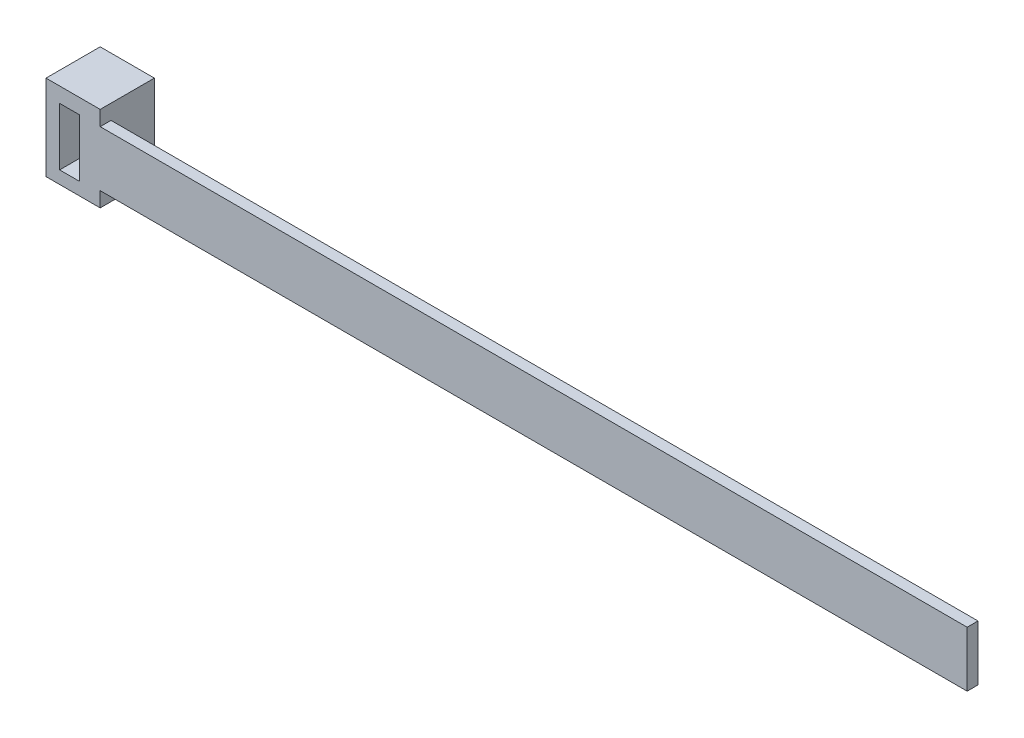
ISO-10303-21;
HEADER;
FILE_DESCRIPTION(('STEP AP214'),'2;1');
FILE_NAME('part.step','',(''),(''),'','','');
FILE_SCHEMA(('AUTOMOTIVE_DESIGN { 1 0 10303 214 1 1 1 1 }'));
ENDSEC;
DATA;
#1=APPLICATION_CONTEXT('core data for automotive mechanical design processes');
#2=APPLICATION_PROTOCOL_DEFINITION('international standard','automotive_design',2000,#1);
#3=PRODUCT_CONTEXT('',#1,'mechanical');
#4=PRODUCT('Part','Part','',(#3));
#5=PRODUCT_RELATED_PRODUCT_CATEGORY('part','',(#4));
#6=PRODUCT_DEFINITION_FORMATION('','',#4);
#7=PRODUCT_DEFINITION_CONTEXT('part definition',#1,'design');
#8=PRODUCT_DEFINITION('design','',#6,#7);
#9=PRODUCT_DEFINITION_SHAPE('','',#8);
#10=(LENGTH_UNIT() NAMED_UNIT(*) SI_UNIT(.MILLI.,.METRE.));
#11=(NAMED_UNIT(*) PLANE_ANGLE_UNIT() SI_UNIT($,.RADIAN.));
#12=(NAMED_UNIT(*) SI_UNIT($,.STERADIAN.) SOLID_ANGLE_UNIT());
#13=UNCERTAINTY_MEASURE_WITH_UNIT(LENGTH_MEASURE(1.E-05),#10,'distance_accuracy_value','');
#14=(GEOMETRIC_REPRESENTATION_CONTEXT(3) GLOBAL_UNCERTAINTY_ASSIGNED_CONTEXT((#13)) GLOBAL_UNIT_ASSIGNED_CONTEXT((#10,
#11,#12)) REPRESENTATION_CONTEXT('',''));
#15=CARTESIAN_POINT('',(0.,0.,0.));
#16=DIRECTION('',(0.,0.,1.));
#17=DIRECTION('',(1.,0.,0.));
#18=AXIS2_PLACEMENT_3D('',#15,#16,#17);
#19=CARTESIAN_POINT('',(-73.0239217256212,5.,-9.38083837570739));
#20=DIRECTION('',(1.,0.,0.));
#21=DIRECTION('',(0.,0.,-1.));
#22=AXIS2_PLACEMENT_3D('',#19,#20,#21);
#23=PLANE('',#22);
#24=DIRECTION('',(0.,0.,1.));
#25=VECTOR('',#24,1.);
#26=CARTESIAN_POINT('',(-73.0239217256212,-5.,-9.38083837570739));
#27=LINE('',#26,#25);
#28=CARTESIAN_POINT('',(-73.0239217256212,-5.,-9.38083837570739));
#29=VERTEX_POINT('',#28);
#30=CARTESIAN_POINT('',(-73.0239217256212,-5.,-3.03083837570739));
#31=VERTEX_POINT('',#30);
#32=EDGE_CURVE('E206',#29,#31,#27,.T.);
#33=ORIENTED_EDGE('',*,*,#32,.T.);
#34=DIRECTION('',(0.,-1.,0.));
#35=VECTOR('',#34,1.);
#36=CARTESIAN_POINT('',(-73.0239217256212,5.,-3.03083837570739));
#37=LINE('',#36,#35);
#38=CARTESIAN_POINT('',(-73.0239217256212,5.,-3.03083837570739));
#39=VERTEX_POINT('',#38);
#40=EDGE_CURVE('E11',#39,#31,#37,.T.);
#41=ORIENTED_EDGE('',*,*,#40,.F.);
#42=DIRECTION('',(0.,0.,1.));
#43=VECTOR('',#42,1.);
#44=CARTESIAN_POINT('',(-73.0239217256212,5.,-9.38083837570739));
#45=LINE('',#44,#43);
#46=CARTESIAN_POINT('',(-73.0239217256212,5.,-9.38083837570739));
#47=VERTEX_POINT('',#46);
#48=EDGE_CURVE('E207',#47,#39,#45,.T.);
#49=ORIENTED_EDGE('',*,*,#48,.F.);
#50=DIRECTION('',(0.,-1.,0.));
#51=VECTOR('',#50,1.);
#52=CARTESIAN_POINT('',(-73.0239217256212,5.,-9.38083837570739));
#53=LINE('',#52,#51);
#54=EDGE_CURVE('E149',#47,#29,#53,.T.);
#55=ORIENTED_EDGE('',*,*,#54,.T.);
#56=EDGE_LOOP('',(#33,#41,#49,#55));
#57=FACE_BOUND('',#56,.T.);
#58=ADVANCED_FACE('F33',(#57),#23,.F.);
#59=CARTESIAN_POINT('',(-66.6739217256212,5.,-3.03083837570739));
#60=DIRECTION('',(0.,0.,-1.));
#61=DIRECTION('',(-1.,0.,0.));
#62=AXIS2_PLACEMENT_3D('',#59,#60,#61);
#63=PLANE('',#62);
#64=DIRECTION('',(1.,0.,0.));
#65=VECTOR('',#64,1.);
#66=CARTESIAN_POINT('',(-71.4239447150806,-3.51553287453044,-3.03083837570739));
#67=LINE('',#66,#65);
#68=CARTESIAN_POINT('',(-71.4239447150806,-3.51553287453044,-3.03083837570739));
#69=VERTEX_POINT('',#68);
#70=CARTESIAN_POINT('',(-69.1172689263801,-3.51553287453044,-3.03083837570739));
#71=VERTEX_POINT('',#70);
#72=EDGE_CURVE('E177',#69,#71,#67,.T.);
#73=ORIENTED_EDGE('',*,*,#72,.F.);
#74=DIRECTION('',(0.,-1.,0.));
#75=VECTOR('',#74,1.);
#76=CARTESIAN_POINT('',(-71.4239447150806,3.2345140651131,-3.03083837570739));
#77=LINE('',#76,#75);
#78=CARTESIAN_POINT('',(-71.4239447150806,3.2345140651131,-3.03083837570739));
#79=VERTEX_POINT('',#78);
#80=EDGE_CURVE('E180',#79,#69,#77,.T.);
#81=ORIENTED_EDGE('',*,*,#80,.F.);
#82=DIRECTION('',(-1.,0.,0.));
#83=VECTOR('',#82,1.);
#84=CARTESIAN_POINT('',(-71.4239447150806,3.2345140651131,-3.03083837570739));
#85=LINE('',#84,#83);
#86=CARTESIAN_POINT('',(-69.1172689263801,3.2345140651131,-3.03083837570739));
#87=VERTEX_POINT('',#86);
#88=EDGE_CURVE('E197',#87,#79,#85,.T.);
#89=ORIENTED_EDGE('',*,*,#88,.F.);
#90=DIRECTION('',(0.,1.,0.));
#91=VECTOR('',#90,1.);
#92=CARTESIAN_POINT('',(-69.1172689263801,3.2345140651131,-3.03083837570739));
#93=LINE('',#92,#91);
#94=EDGE_CURVE('E55',#71,#87,#93,.T.);
#95=ORIENTED_EDGE('',*,*,#94,.F.);
#96=EDGE_LOOP('',(#73,#81,#89,#95));
#97=FACE_BOUND('',#96,.T.);
#98=DIRECTION('',(0.,-1.,0.));
#99=VECTOR('',#98,1.);
#100=CARTESIAN_POINT('',(-66.6739217256212,-5.,-3.03083837570739));
#101=LINE('',#100,#99);
#102=CARTESIAN_POINT('',(-66.6739217256212,-3.24674392594689,-3.03083837570739));
#103=VERTEX_POINT('',#102);
#104=CARTESIAN_POINT('',(-66.6739217256212,-5.,-3.03083837570739));
#105=VERTEX_POINT('',#104);
#106=EDGE_CURVE('E164',#103,#105,#101,.T.);
#107=ORIENTED_EDGE('',*,*,#106,.F.);
#108=DIRECTION('',(-1.,0.,0.));
#109=VECTOR('',#108,1.);
#110=CARTESIAN_POINT('',(34.9260782743788,-3.24674392594689,-3.03083837570739));
#111=LINE('',#110,#109);
#112=CARTESIAN_POINT('',(34.9260782743788,-3.24674392594689,-3.03083837570739));
#113=VERTEX_POINT('',#112);
#114=EDGE_CURVE('E126',#113,#103,#111,.T.);
#115=ORIENTED_EDGE('',*,*,#114,.F.);
#116=DIRECTION('',(0.,-1.,0.));
#117=VECTOR('',#116,1.);
#118=CARTESIAN_POINT('',(34.9260782743788,5.,-3.03083837570739));
#119=LINE('',#118,#117);
#120=CARTESIAN_POINT('',(34.9260782743788,3.24674392594687,-3.03083837570739));
#121=VERTEX_POINT('',#120);
#122=EDGE_CURVE('E40',#121,#113,#119,.T.);
#123=ORIENTED_EDGE('',*,*,#122,.F.);
#124=DIRECTION('',(1.,0.,0.));
#125=VECTOR('',#124,1.);
#126=CARTESIAN_POINT('',(-66.6739217256212,3.24674392594689,-3.03083837570739));
#127=LINE('',#126,#125);
#128=CARTESIAN_POINT('',(-66.6739217256212,3.24674392594689,-3.03083837570739));
#129=VERTEX_POINT('',#128);
#130=EDGE_CURVE('E162',#129,#121,#127,.T.);
#131=ORIENTED_EDGE('',*,*,#130,.F.);
#132=DIRECTION('',(0.,-1.,0.));
#133=VECTOR('',#132,1.);
#134=CARTESIAN_POINT('',(-66.6739217256212,5.,-3.03083837570739));
#135=LINE('',#134,#133);
#136=CARTESIAN_POINT('',(-66.6739217256212,5.,-3.03083837570739));
#137=VERTEX_POINT('',#136);
#138=EDGE_CURVE('E170',#137,#129,#135,.T.);
#139=ORIENTED_EDGE('',*,*,#138,.F.);
#140=DIRECTION('',(1.,0.,0.));
#141=VECTOR('',#140,1.);
#142=CARTESIAN_POINT('',(-73.0239217256212,5.,-3.03083837570739));
#143=LINE('',#142,#141);
#144=EDGE_CURVE('E210',#39,#137,#143,.T.);
#145=ORIENTED_EDGE('',*,*,#144,.F.);
#146=ORIENTED_EDGE('',*,*,#40,.T.);
#147=DIRECTION('',(1.,0.,0.));
#148=VECTOR('',#147,1.);
#149=CARTESIAN_POINT('',(-66.6739217256212,-5.,-3.03083837570739));
#150=LINE('',#149,#148);
#151=EDGE_CURVE('E220',#31,#105,#150,.T.);
#152=ORIENTED_EDGE('',*,*,#151,.T.);
#153=EDGE_LOOP('',(#107,#115,#123,#131,#139,#145,#146,#152));
#154=FACE_BOUND('',#153,.T.);
#155=ADVANCED_FACE('F160',(#97,#154),#63,.F.);
#156=CARTESIAN_POINT('',(34.9260782743788,5.,-3.03083837570739));
#157=DIRECTION('',(-1.,0.,0.));
#158=DIRECTION('',(0.,0.,1.));
#159=AXIS2_PLACEMENT_3D('',#156,#157,#158);
#160=PLANE('',#159);
#161=ORIENTED_EDGE('',*,*,#122,.T.);
#162=DIRECTION('',(0.,0.,-1.));
#163=VECTOR('',#162,1.);
#164=CARTESIAN_POINT('',(34.9260782743788,-3.24674392594689,-3.02983837570739));
#165=LINE('',#164,#163);
#166=CARTESIAN_POINT('',(34.9260782743788,-3.24674392594689,-4.30083837570739));
#167=VERTEX_POINT('',#166);
#168=EDGE_CURVE('E130',#113,#167,#165,.T.);
#169=ORIENTED_EDGE('',*,*,#168,.T.);
#170=DIRECTION('',(0.,-1.,0.));
#171=VECTOR('',#170,1.);
#172=CARTESIAN_POINT('',(34.9260782743788,5.,-4.30083837570739));
#173=LINE('',#172,#171);
#174=CARTESIAN_POINT('',(34.9260782743788,3.24674392594687,-4.30083837570739));
#175=VERTEX_POINT('',#174);
#176=EDGE_CURVE('E139',#175,#167,#173,.T.);
#177=ORIENTED_EDGE('',*,*,#176,.F.);
#178=DIRECTION('',(0.,0.,-1.));
#179=VECTOR('',#178,1.);
#180=CARTESIAN_POINT('',(34.9260782743788,3.24674392594687,-3.02983837570739));
#181=LINE('',#180,#179);
#182=EDGE_CURVE('E157',#121,#175,#181,.T.);
#183=ORIENTED_EDGE('',*,*,#182,.F.);
#184=EDGE_LOOP('',(#161,#169,#177,#183));
#185=FACE_BOUND('',#184,.T.);
#186=ADVANCED_FACE('F156',(#185),#160,.F.);
#187=CARTESIAN_POINT('',(-66.6739217256212,5.,-4.30083837570739));
#188=DIRECTION('',(0.,0.,1.));
#189=DIRECTION('',(1.,0.,0.));
#190=AXIS2_PLACEMENT_3D('',#187,#188,#189);
#191=PLANE('',#190);
#192=ORIENTED_EDGE('',*,*,#176,.T.);
#193=DIRECTION('',(1.,0.,0.));
#194=VECTOR('',#193,1.);
#195=CARTESIAN_POINT('',(34.9260782743788,-3.24674392594689,-4.30083837570739));
#196=LINE('',#195,#194);
#197=CARTESIAN_POINT('',(-66.6739217256212,-3.24674392594689,-4.30083837570739));
#198=VERTEX_POINT('',#197);
#199=EDGE_CURVE('E123',#198,#167,#196,.T.);
#200=ORIENTED_EDGE('',*,*,#199,.F.);
#201=DIRECTION('',(0.,-1.,0.));
#202=VECTOR('',#201,1.);
#203=CARTESIAN_POINT('',(-66.6739217256212,5.,-4.30083837570739));
#204=LINE('',#203,#202);
#205=CARTESIAN_POINT('',(-66.6739217256212,3.24674392594689,-4.30083837570739));
#206=VERTEX_POINT('',#205);
#207=EDGE_CURVE('E137',#206,#198,#204,.T.);
#208=ORIENTED_EDGE('',*,*,#207,.F.);
#209=DIRECTION('',(-1.,0.,0.));
#210=VECTOR('',#209,1.);
#211=CARTESIAN_POINT('',(-66.6739217256212,3.24674392594689,-4.30083837570739));
#212=LINE('',#211,#210);
#213=EDGE_CURVE('E172',#175,#206,#212,.T.);
#214=ORIENTED_EDGE('',*,*,#213,.F.);
#215=EDGE_LOOP('',(#192,#200,#208,#214));
#216=FACE_BOUND('',#215,.T.);
#217=ADVANCED_FACE('F135',(#216),#191,.F.);
#218=CARTESIAN_POINT('',(-66.6739217256212,5.,-9.38083837570739));
#219=DIRECTION('',(-1.,0.,0.));
#220=DIRECTION('',(0.,0.,1.));
#221=AXIS2_PLACEMENT_3D('',#218,#219,#220);
#222=PLANE('',#221);
#223=DIRECTION('',(0.,0.,-1.));
#224=VECTOR('',#223,1.);
#225=CARTESIAN_POINT('',(-66.6739217256212,-5.,-9.38083837570739));
#226=LINE('',#225,#224);
#227=CARTESIAN_POINT('',(-66.6739217256212,-5.,-9.38083837570739));
#228=VERTEX_POINT('',#227);
#229=EDGE_CURVE('E47',#105,#228,#226,.T.);
#230=ORIENTED_EDGE('',*,*,#229,.T.);
#231=DIRECTION('',(0.,-1.,0.));
#232=VECTOR('',#231,1.);
#233=CARTESIAN_POINT('',(-66.6739217256212,5.,-9.38083837570739));
#234=LINE('',#233,#232);
#235=CARTESIAN_POINT('',(-66.6739217256212,5.,-9.38083837570739));
#236=VERTEX_POINT('',#235);
#237=EDGE_CURVE('E145',#236,#228,#234,.T.);
#238=ORIENTED_EDGE('',*,*,#237,.F.);
#239=DIRECTION('',(0.,0.,-1.));
#240=VECTOR('',#239,1.);
#241=CARTESIAN_POINT('',(-66.6739217256212,5.,-9.38083837570739));
#242=LINE('',#241,#240);
#243=EDGE_CURVE('E214',#137,#236,#242,.T.);
#244=ORIENTED_EDGE('',*,*,#243,.F.);
#245=ORIENTED_EDGE('',*,*,#138,.T.);
#246=DIRECTION('',(0.,0.,-1.));
#247=VECTOR('',#246,1.);
#248=CARTESIAN_POINT('',(-66.6739217256212,3.24674392594689,-3.02983837570739));
#249=LINE('',#248,#247);
#250=EDGE_CURVE('E143',#129,#206,#249,.T.);
#251=ORIENTED_EDGE('',*,*,#250,.T.);
#252=ORIENTED_EDGE('',*,*,#207,.T.);
#253=DIRECTION('',(0.,0.,-1.));
#254=VECTOR('',#253,1.);
#255=CARTESIAN_POINT('',(-66.6739217256212,-3.24674392594689,-3.02983837570739));
#256=LINE('',#255,#254);
#257=EDGE_CURVE('E120',#103,#198,#256,.T.);
#258=ORIENTED_EDGE('',*,*,#257,.F.);
#259=ORIENTED_EDGE('',*,*,#106,.T.);
#260=EDGE_LOOP('',(#230,#238,#244,#245,#251,#252,#258,#259));
#261=FACE_BOUND('',#260,.T.);
#262=ADVANCED_FACE('F141',(#261),#222,.F.);
#263=CARTESIAN_POINT('',(-73.0239217256212,5.,-9.38083837570739));
#264=DIRECTION('',(0.,0.,1.));
#265=DIRECTION('',(1.,0.,0.));
#266=AXIS2_PLACEMENT_3D('',#263,#264,#265);
#267=PLANE('',#266);
#268=DIRECTION('',(1.,0.,0.));
#269=VECTOR('',#268,1.);
#270=CARTESIAN_POINT('',(-71.4239447150806,3.2345140651131,-9.38083837570739));
#271=LINE('',#270,#269);
#272=CARTESIAN_POINT('',(-71.4239447150806,3.2345140651131,-9.38083837570739));
#273=VERTEX_POINT('',#272);
#274=CARTESIAN_POINT('',(-69.1172689263801,3.2345140651131,-9.38083837570739));
#275=VERTEX_POINT('',#274);
#276=EDGE_CURVE('E185',#273,#275,#271,.T.);
#277=ORIENTED_EDGE('',*,*,#276,.F.);
#278=DIRECTION('',(0.,1.,0.));
#279=VECTOR('',#278,1.);
#280=CARTESIAN_POINT('',(-71.4239447150806,3.2345140651131,-9.38083837570739));
#281=LINE('',#280,#279);
#282=CARTESIAN_POINT('',(-71.4239447150806,-3.51553287453044,-9.38083837570739));
#283=VERTEX_POINT('',#282);
#284=EDGE_CURVE('E183',#283,#273,#281,.T.);
#285=ORIENTED_EDGE('',*,*,#284,.F.);
#286=DIRECTION('',(-1.,0.,0.));
#287=VECTOR('',#286,1.);
#288=CARTESIAN_POINT('',(-71.4239447150806,-3.51553287453044,-9.38083837570739));
#289=LINE('',#288,#287);
#290=CARTESIAN_POINT('',(-69.1172689263801,-3.51553287453044,-9.38083837570739));
#291=VERTEX_POINT('',#290);
#292=EDGE_CURVE('E191',#291,#283,#289,.T.);
#293=ORIENTED_EDGE('',*,*,#292,.F.);
#294=DIRECTION('',(0.,-1.,0.));
#295=VECTOR('',#294,1.);
#296=CARTESIAN_POINT('',(-69.1172689263801,3.2345140651131,-9.38083837570739));
#297=LINE('',#296,#295);
#298=EDGE_CURVE('E188',#275,#291,#297,.T.);
#299=ORIENTED_EDGE('',*,*,#298,.F.);
#300=EDGE_LOOP('',(#277,#285,#293,#299));
#301=FACE_BOUND('',#300,.T.);
#302=DIRECTION('',(-1.,0.,0.));
#303=VECTOR('',#302,1.);
#304=CARTESIAN_POINT('',(-73.0239217256212,-5.,-9.38083837570739));
#305=LINE('',#304,#303);
#306=EDGE_CURVE('E211',#228,#29,#305,.T.);
#307=ORIENTED_EDGE('',*,*,#306,.T.);
#308=ORIENTED_EDGE('',*,*,#54,.F.);
#309=DIRECTION('',(-1.,0.,0.));
#310=VECTOR('',#309,1.);
#311=CARTESIAN_POINT('',(-73.0239217256212,5.,-9.38083837570739));
#312=LINE('',#311,#310);
#313=EDGE_CURVE('E216',#236,#47,#312,.T.);
#314=ORIENTED_EDGE('',*,*,#313,.F.);
#315=ORIENTED_EDGE('',*,*,#237,.T.);
#316=EDGE_LOOP('',(#307,#308,#314,#315));
#317=FACE_BOUND('',#316,.T.);
#318=ADVANCED_FACE('F235',(#301,#317),#267,.F.);
#319=CARTESIAN_POINT('',(0.,5.,0.));
#320=DIRECTION('',(0.,1.,0.));
#321=DIRECTION('',(0.,0.,1.));
#322=AXIS2_PLACEMENT_3D('',#319,#320,#321);
#323=PLANE('',#322);
#324=ORIENTED_EDGE('',*,*,#144,.T.);
#325=ORIENTED_EDGE('',*,*,#243,.T.);
#326=ORIENTED_EDGE('',*,*,#313,.T.);
#327=ORIENTED_EDGE('',*,*,#48,.T.);
#328=EDGE_LOOP('',(#324,#325,#326,#327));
#329=FACE_BOUND('',#328,.T.);
#330=ADVANCED_FACE('F233',(#329),#323,.T.);
#331=CARTESIAN_POINT('',(0.,-5.,0.));
#332=DIRECTION('',(0.,1.,0.));
#333=DIRECTION('',(0.,0.,1.));
#334=AXIS2_PLACEMENT_3D('',#331,#332,#333);
#335=PLANE('',#334);
#336=ORIENTED_EDGE('',*,*,#229,.F.);
#337=ORIENTED_EDGE('',*,*,#151,.F.);
#338=ORIENTED_EDGE('',*,*,#32,.F.);
#339=ORIENTED_EDGE('',*,*,#306,.F.);
#340=EDGE_LOOP('',(#336,#337,#338,#339));
#341=FACE_BOUND('',#340,.T.);
#342=ADVANCED_FACE('F231',(#341),#335,.F.);
#343=CARTESIAN_POINT('',(-71.4239447150806,3.2345140651131,-3.02983837570739));
#344=DIRECTION('',(-1.,0.,0.));
#345=DIRECTION('',(0.,0.,1.));
#346=AXIS2_PLACEMENT_3D('',#343,#344,#345);
#347=PLANE('',#346);
#348=ORIENTED_EDGE('',*,*,#80,.T.);
#349=DIRECTION('',(0.,0.,-1.));
#350=VECTOR('',#349,1.);
#351=CARTESIAN_POINT('',(-71.4239447150806,-3.51553287453044,-3.02983837570739));
#352=LINE('',#351,#350);
#353=EDGE_CURVE('E195',#69,#283,#352,.T.);
#354=ORIENTED_EDGE('',*,*,#353,.T.);
#355=ORIENTED_EDGE('',*,*,#284,.T.);
#356=DIRECTION('',(0.,0.,-1.));
#357=VECTOR('',#356,1.);
#358=CARTESIAN_POINT('',(-71.4239447150806,3.2345140651131,-3.02983837570739));
#359=LINE('',#358,#357);
#360=EDGE_CURVE('E194',#79,#273,#359,.T.);
#361=ORIENTED_EDGE('',*,*,#360,.F.);
#362=EDGE_LOOP('',(#348,#354,#355,#361));
#363=FACE_BOUND('',#362,.T.);
#364=ADVANCED_FACE('F285',(#363),#347,.F.);
#365=CARTESIAN_POINT('',(-71.4239447150806,-3.51553287453044,-3.02983837570739));
#366=DIRECTION('',(0.,-1.,0.));
#367=DIRECTION('',(0.,0.,-1.));
#368=AXIS2_PLACEMENT_3D('',#365,#366,#367);
#369=PLANE('',#368);
#370=ORIENTED_EDGE('',*,*,#72,.T.);
#371=DIRECTION('',(0.,0.,-1.));
#372=VECTOR('',#371,1.);
#373=CARTESIAN_POINT('',(-69.1172689263801,-3.51553287453044,-3.02983837570739));
#374=LINE('',#373,#372);
#375=EDGE_CURVE('E198',#71,#291,#374,.T.);
#376=ORIENTED_EDGE('',*,*,#375,.T.);
#377=ORIENTED_EDGE('',*,*,#292,.T.);
#378=ORIENTED_EDGE('',*,*,#353,.F.);
#379=EDGE_LOOP('',(#370,#376,#377,#378));
#380=FACE_BOUND('',#379,.T.);
#381=ADVANCED_FACE('F310',(#380),#369,.F.);
#382=CARTESIAN_POINT('',(-69.1172689263801,3.2345140651131,-3.02983837570739));
#383=DIRECTION('',(1.,0.,0.));
#384=DIRECTION('',(0.,0.,-1.));
#385=AXIS2_PLACEMENT_3D('',#382,#383,#384);
#386=PLANE('',#385);
#387=ORIENTED_EDGE('',*,*,#94,.T.);
#388=DIRECTION('',(0.,0.,-1.));
#389=VECTOR('',#388,1.);
#390=CARTESIAN_POINT('',(-69.1172689263801,3.2345140651131,-3.02983837570739));
#391=LINE('',#390,#389);
#392=EDGE_CURVE('E200',#87,#275,#391,.T.);
#393=ORIENTED_EDGE('',*,*,#392,.T.);
#394=ORIENTED_EDGE('',*,*,#298,.T.);
#395=ORIENTED_EDGE('',*,*,#375,.F.);
#396=EDGE_LOOP('',(#387,#393,#394,#395));
#397=FACE_BOUND('',#396,.T.);
#398=ADVANCED_FACE('F313',(#397),#386,.F.);
#399=CARTESIAN_POINT('',(-71.4239447150806,3.2345140651131,-3.02983837570739));
#400=DIRECTION('',(0.,1.,0.));
#401=DIRECTION('',(0.,0.,1.));
#402=AXIS2_PLACEMENT_3D('',#399,#400,#401);
#403=PLANE('',#402);
#404=ORIENTED_EDGE('',*,*,#88,.T.);
#405=ORIENTED_EDGE('',*,*,#360,.T.);
#406=ORIENTED_EDGE('',*,*,#276,.T.);
#407=ORIENTED_EDGE('',*,*,#392,.F.);
#408=EDGE_LOOP('',(#404,#405,#406,#407));
#409=FACE_BOUND('',#408,.T.);
#410=ADVANCED_FACE('F295',(#409),#403,.F.);
#411=CARTESIAN_POINT('',(-66.6739217256212,3.24674392594689,-3.02983837570739));
#412=DIRECTION('',(0.,-1.,0.));
#413=DIRECTION('',(1.,0.,0.));
#414=AXIS2_PLACEMENT_3D('',#411,#412,#413);
#415=PLANE('',#414);
#416=ORIENTED_EDGE('',*,*,#130,.T.);
#417=ORIENTED_EDGE('',*,*,#182,.T.);
#418=ORIENTED_EDGE('',*,*,#213,.T.);
#419=ORIENTED_EDGE('',*,*,#250,.F.);
#420=EDGE_LOOP('',(#416,#417,#418,#419));
#421=FACE_BOUND('',#420,.T.);
#422=ADVANCED_FACE('F291',(#421),#415,.F.);
#423=CARTESIAN_POINT('',(34.9260782743788,-3.24674392594689,-3.02983837570739));
#424=DIRECTION('',(0.,1.,0.));
#425=DIRECTION('',(0.,0.,1.));
#426=AXIS2_PLACEMENT_3D('',#423,#424,#425);
#427=PLANE('',#426);
#428=ORIENTED_EDGE('',*,*,#114,.T.);
#429=ORIENTED_EDGE('',*,*,#257,.T.);
#430=ORIENTED_EDGE('',*,*,#199,.T.);
#431=ORIENTED_EDGE('',*,*,#168,.F.);
#432=EDGE_LOOP('',(#428,#429,#430,#431));
#433=FACE_BOUND('',#432,.T.);
#434=ADVANCED_FACE('F122',(#433),#427,.F.);
#435=CLOSED_SHELL('',(#58,#155,#186,#217,#262,#318,#330,#342,#364,#381,#398,#410,#422,#434));
#436=MANIFOLD_SOLID_BREP('B2',#435);
#437=ADVANCED_BREP_SHAPE_REPRESENTATION('',(#18,#436),#14);
#438=SHAPE_DEFINITION_REPRESENTATION(#9,#437);
ENDSEC;
END-ISO-10303-21;
